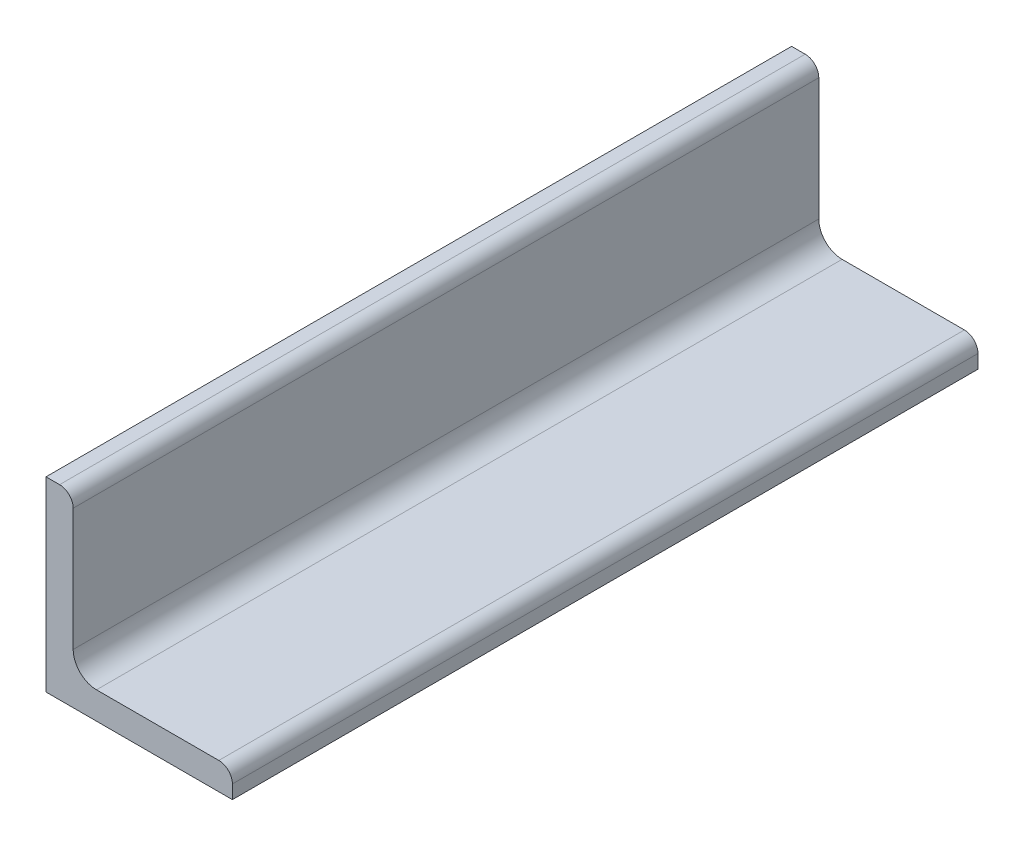
ISO-10303-21;
HEADER;
FILE_DESCRIPTION(('STEP AP214'),'2;1');
FILE_NAME('part.step','',(''),(''),'','','');
FILE_SCHEMA(('AUTOMOTIVE_DESIGN { 1 0 10303 214 1 1 1 1 }'));
ENDSEC;
DATA;
#1=APPLICATION_CONTEXT('core data for automotive mechanical design processes');
#2=APPLICATION_PROTOCOL_DEFINITION('international standard','automotive_design',2000,#1);
#3=PRODUCT_CONTEXT('',#1,'mechanical');
#4=PRODUCT('Part','Part','',(#3));
#5=PRODUCT_RELATED_PRODUCT_CATEGORY('part','',(#4));
#6=PRODUCT_DEFINITION_FORMATION('','',#4);
#7=PRODUCT_DEFINITION_CONTEXT('part definition',#1,'design');
#8=PRODUCT_DEFINITION('design','',#6,#7);
#9=PRODUCT_DEFINITION_SHAPE('','',#8);
#10=(LENGTH_UNIT() NAMED_UNIT(*) SI_UNIT(.MILLI.,.METRE.));
#11=(NAMED_UNIT(*) PLANE_ANGLE_UNIT() SI_UNIT($,.RADIAN.));
#12=(NAMED_UNIT(*) SI_UNIT($,.STERADIAN.) SOLID_ANGLE_UNIT());
#13=UNCERTAINTY_MEASURE_WITH_UNIT(LENGTH_MEASURE(1.E-05),#10,'distance_accuracy_value','');
#14=(GEOMETRIC_REPRESENTATION_CONTEXT(3) GLOBAL_UNCERTAINTY_ASSIGNED_CONTEXT((#13)) GLOBAL_UNIT_ASSIGNED_CONTEXT((#10,
#11,#12)) REPRESENTATION_CONTEXT('',''));
#15=CARTESIAN_POINT('',(0.,0.,0.));
#16=DIRECTION('',(0.,0.,1.));
#17=DIRECTION('',(1.,0.,0.));
#18=AXIS2_PLACEMENT_3D('',#15,#16,#17);
#19=CARTESIAN_POINT('',(0.490776827053332,76.2882459217981,304.8));
#20=DIRECTION('',(1.,0.,0.));
#21=DIRECTION('',(0.,0.,-1.));
#22=AXIS2_PLACEMENT_3D('',#19,#20,#21);
#23=PLANE('',#22);
#24=DIRECTION('',(0.,-1.,0.));
#25=VECTOR('',#24,1.);
#26=CARTESIAN_POINT('',(0.490776827053332,76.2882459217981,0.));
#27=LINE('',#26,#25);
#28=CARTESIAN_POINT('',(0.490776827053332,76.2882459217981,0.));
#29=VERTEX_POINT('',#28);
#30=CARTESIAN_POINT('',(0.490776827053332,0.0882459217980795,0.));
#31=VERTEX_POINT('',#30);
#32=EDGE_CURVE('E135',#29,#31,#27,.T.);
#33=ORIENTED_EDGE('',*,*,#32,.T.);
#34=DIRECTION('',(0.,0.,-1.));
#35=VECTOR('',#34,1.);
#36=CARTESIAN_POINT('',(0.490776827053332,0.0882459217980795,304.8));
#37=LINE('',#36,#35);
#38=CARTESIAN_POINT('',(0.490776827053332,0.0882459217980795,304.8));
#39=VERTEX_POINT('',#38);
#40=EDGE_CURVE('E11',#39,#31,#37,.T.);
#41=ORIENTED_EDGE('',*,*,#40,.F.);
#42=DIRECTION('',(0.,-1.,0.));
#43=VECTOR('',#42,1.);
#44=CARTESIAN_POINT('',(0.490776827053332,76.2882459217981,304.8));
#45=LINE('',#44,#43);
#46=CARTESIAN_POINT('',(0.490776827053332,76.2882459217981,304.8));
#47=VERTEX_POINT('',#46);
#48=EDGE_CURVE('E151',#47,#39,#45,.T.);
#49=ORIENTED_EDGE('',*,*,#48,.F.);
#50=DIRECTION('',(0.,0.,-1.));
#51=VECTOR('',#50,1.);
#52=CARTESIAN_POINT('',(0.490776827053332,76.2882459217981,304.8));
#53=LINE('',#52,#51);
#54=EDGE_CURVE('E131',#47,#29,#53,.T.);
#55=ORIENTED_EDGE('',*,*,#54,.T.);
#56=EDGE_LOOP('',(#33,#41,#49,#55));
#57=FACE_BOUND('',#56,.T.);
#58=ADVANCED_FACE('F33',(#57),#23,.F.);
#59=CARTESIAN_POINT('',(0.490776827053332,0.0882459217980795,304.8));
#60=DIRECTION('',(0.,1.,0.));
#61=DIRECTION('',(0.,0.,1.));
#62=AXIS2_PLACEMENT_3D('',#59,#60,#61);
#63=PLANE('',#62);
#64=DIRECTION('',(1.,0.,0.));
#65=VECTOR('',#64,1.);
#66=CARTESIAN_POINT('',(0.490776827053332,0.0882459217980795,0.));
#67=LINE('',#66,#65);
#68=CARTESIAN_POINT('',(76.6907768270533,0.0882459217980795,0.));
#69=VERTEX_POINT('',#68);
#70=EDGE_CURVE('E138',#31,#69,#67,.T.);
#71=ORIENTED_EDGE('',*,*,#70,.T.);
#72=DIRECTION('',(0.,0.,-1.));
#73=VECTOR('',#72,1.);
#74=CARTESIAN_POINT('',(76.6907768270533,0.0882459217980795,304.8));
#75=LINE('',#74,#73);
#76=CARTESIAN_POINT('',(76.6907768270533,0.0882459217980795,304.8));
#77=VERTEX_POINT('',#76);
#78=EDGE_CURVE('E41',#77,#69,#75,.T.);
#79=ORIENTED_EDGE('',*,*,#78,.F.);
#80=DIRECTION('',(1.,0.,0.));
#81=VECTOR('',#80,1.);
#82=CARTESIAN_POINT('',(0.490776827053332,0.0882459217980795,304.8));
#83=LINE('',#82,#81);
#84=EDGE_CURVE('E95',#39,#77,#83,.T.);
#85=ORIENTED_EDGE('',*,*,#84,.F.);
#86=ORIENTED_EDGE('',*,*,#40,.T.);
#87=EDGE_LOOP('',(#71,#79,#85,#86));
#88=FACE_BOUND('',#87,.T.);
#89=ADVANCED_FACE('F194',(#88),#63,.F.);
#90=CARTESIAN_POINT('',(76.6907768270533,0.0882459217980795,304.8));
#91=DIRECTION('',(-1.,0.,0.));
#92=DIRECTION('',(0.,0.,1.));
#93=AXIS2_PLACEMENT_3D('',#90,#91,#92);
#94=PLANE('',#93);
#95=DIRECTION('',(0.,1.,0.));
#96=VECTOR('',#95,1.);
#97=CARTESIAN_POINT('',(76.6907768270533,0.0882459217980795,0.));
#98=LINE('',#97,#96);
#99=CARTESIAN_POINT('',(76.6907768270533,5.64449592179808,0.));
#100=VERTEX_POINT('',#99);
#101=EDGE_CURVE('E140',#69,#100,#98,.T.);
#102=ORIENTED_EDGE('',*,*,#101,.T.);
#103=DIRECTION('',(0.,0.,-1.));
#104=VECTOR('',#103,1.);
#105=CARTESIAN_POINT('',(76.6907768270533,5.64449592179808,304.8));
#106=LINE('',#105,#104);
#107=CARTESIAN_POINT('',(76.6907768270533,5.64449592179808,304.8));
#108=VERTEX_POINT('',#107);
#109=EDGE_CURVE('E161',#108,#100,#106,.T.);
#110=ORIENTED_EDGE('',*,*,#109,.F.);
#111=DIRECTION('',(0.,1.,0.));
#112=VECTOR('',#111,1.);
#113=CARTESIAN_POINT('',(76.6907768270533,0.0882459217980795,304.8));
#114=LINE('',#113,#112);
#115=EDGE_CURVE('E169',#77,#108,#114,.T.);
#116=ORIENTED_EDGE('',*,*,#115,.F.);
#117=ORIENTED_EDGE('',*,*,#78,.T.);
#118=EDGE_LOOP('',(#102,#110,#116,#117));
#119=FACE_BOUND('',#118,.T.);
#120=ADVANCED_FACE('F167',(#119),#94,.F.);
#121=CARTESIAN_POINT('',(71.1345268270533,5.64449592179808,304.8));
#122=DIRECTION('',(0.,0.,-1.));
#123=DIRECTION('',(-1.,0.,0.));
#124=AXIS2_PLACEMENT_3D('',#121,#122,#123);
#125=CYLINDRICAL_SURFACE('',#124,5.55625);
#126=CARTESIAN_POINT('',(71.1345268270533,5.64449592179808,0.));
#127=DIRECTION('',(0.,0.,1.));
#128=DIRECTION('',(1.,0.,0.));
#129=AXIS2_PLACEMENT_3D('',#126,#127,#128);
#130=CIRCLE('',#129,5.55625);
#131=CARTESIAN_POINT('',(71.1345268270533,11.2007459217981,0.));
#132=VERTEX_POINT('',#131);
#133=EDGE_CURVE('E142',#100,#132,#130,.T.);
#134=ORIENTED_EDGE('',*,*,#133,.T.);
#135=DIRECTION('',(0.,0.,-1.));
#136=VECTOR('',#135,1.);
#137=CARTESIAN_POINT('',(71.1345268270533,11.2007459217981,304.8));
#138=LINE('',#137,#136);
#139=CARTESIAN_POINT('',(71.1345268270533,11.2007459217981,304.8));
#140=VERTEX_POINT('',#139);
#141=EDGE_CURVE('E158',#140,#132,#138,.T.);
#142=ORIENTED_EDGE('',*,*,#141,.F.);
#143=CARTESIAN_POINT('',(71.1345268270533,5.64449592179808,304.8));
#144=DIRECTION('',(0.,0.,1.));
#145=DIRECTION('',(1.,0.,0.));
#146=AXIS2_PLACEMENT_3D('',#143,#144,#145);
#147=CIRCLE('',#146,5.55625);
#148=EDGE_CURVE('E185',#108,#140,#147,.T.);
#149=ORIENTED_EDGE('',*,*,#148,.F.);
#150=ORIENTED_EDGE('',*,*,#109,.T.);
#151=EDGE_LOOP('',(#134,#142,#149,#150));
#152=FACE_BOUND('',#151,.T.);
#153=ADVANCED_FACE('F178',(#152),#125,.T.);
#154=CARTESIAN_POINT('',(71.1345268270533,11.2007459217981,304.8));
#155=DIRECTION('',(0.,-1.,0.));
#156=DIRECTION('',(0.,0.,-1.));
#157=AXIS2_PLACEMENT_3D('',#154,#155,#156);
#158=PLANE('',#157);
#159=DIRECTION('',(-1.,0.,0.));
#160=VECTOR('',#159,1.);
#161=CARTESIAN_POINT('',(71.1345268270533,11.2007459217981,0.));
#162=LINE('',#161,#160);
#163=CARTESIAN_POINT('',(21.1282768270533,11.2007459217981,0.));
#164=VERTEX_POINT('',#163);
#165=EDGE_CURVE('E144',#132,#164,#162,.T.);
#166=ORIENTED_EDGE('',*,*,#165,.T.);
#167=DIRECTION('',(0.,0.,-1.));
#168=VECTOR('',#167,1.);
#169=CARTESIAN_POINT('',(21.1282768270533,11.2007459217981,304.8));
#170=LINE('',#169,#168);
#171=CARTESIAN_POINT('',(21.1282768270533,11.2007459217981,304.8));
#172=VERTEX_POINT('',#171);
#173=EDGE_CURVE('E155',#172,#164,#170,.T.);
#174=ORIENTED_EDGE('',*,*,#173,.F.);
#175=DIRECTION('',(-1.,0.,0.));
#176=VECTOR('',#175,1.);
#177=CARTESIAN_POINT('',(71.1345268270533,11.2007459217981,304.8));
#178=LINE('',#177,#176);
#179=EDGE_CURVE('E184',#140,#172,#178,.T.);
#180=ORIENTED_EDGE('',*,*,#179,.F.);
#181=ORIENTED_EDGE('',*,*,#141,.T.);
#182=EDGE_LOOP('',(#166,#174,#180,#181));
#183=FACE_BOUND('',#182,.T.);
#184=ADVANCED_FACE('F182',(#183),#158,.F.);
#185=CARTESIAN_POINT('',(21.1282768270533,20.7257459217981,304.8));
#186=DIRECTION('',(0.,0.,-1.));
#187=DIRECTION('',(-1.,0.,0.));
#188=AXIS2_PLACEMENT_3D('',#185,#186,#187);
#189=CYLINDRICAL_SURFACE('',#188,9.52499999999999);
#190=CARTESIAN_POINT('',(21.1282768270533,20.7257459217981,0.));
#191=DIRECTION('',(0.,0.,-1.));
#192=DIRECTION('',(1.,0.,0.));
#193=AXIS2_PLACEMENT_3D('',#190,#191,#192);
#194=CIRCLE('',#193,9.52499999999999);
#195=CARTESIAN_POINT('',(11.6032768270533,20.7257459217981,0.));
#196=VERTEX_POINT('',#195);
#197=EDGE_CURVE('E146',#164,#196,#194,.T.);
#198=ORIENTED_EDGE('',*,*,#197,.T.);
#199=DIRECTION('',(0.,0.,-1.));
#200=VECTOR('',#199,1.);
#201=CARTESIAN_POINT('',(11.6032768270533,20.7257459217981,304.8));
#202=LINE('',#201,#200);
#203=CARTESIAN_POINT('',(11.6032768270533,20.7257459217981,304.8));
#204=VERTEX_POINT('',#203);
#205=EDGE_CURVE('E126',#204,#196,#202,.T.);
#206=ORIENTED_EDGE('',*,*,#205,.F.);
#207=CARTESIAN_POINT('',(21.1282768270533,20.7257459217981,304.8));
#208=DIRECTION('',(0.,0.,-1.));
#209=DIRECTION('',(1.,0.,0.));
#210=AXIS2_PLACEMENT_3D('',#207,#208,#209);
#211=CIRCLE('',#210,9.52499999999999);
#212=EDGE_CURVE('E117',#172,#204,#211,.T.);
#213=ORIENTED_EDGE('',*,*,#212,.F.);
#214=ORIENTED_EDGE('',*,*,#173,.T.);
#215=EDGE_LOOP('',(#198,#206,#213,#214));
#216=FACE_BOUND('',#215,.T.);
#217=ADVANCED_FACE('F206',(#216),#189,.F.);
#218=CARTESIAN_POINT('',(11.6032768270533,20.7257459217981,304.8));
#219=DIRECTION('',(-1.,0.,0.));
#220=DIRECTION('',(0.,0.,1.));
#221=AXIS2_PLACEMENT_3D('',#218,#219,#220);
#222=PLANE('',#221);
#223=DIRECTION('',(0.,1.,0.));
#224=VECTOR('',#223,1.);
#225=CARTESIAN_POINT('',(11.6032768270533,20.7257459217981,0.));
#226=LINE('',#225,#224);
#227=CARTESIAN_POINT('',(11.6032768270533,70.7319959217981,0.));
#228=VERTEX_POINT('',#227);
#229=EDGE_CURVE('E125',#196,#228,#226,.T.);
#230=ORIENTED_EDGE('',*,*,#229,.T.);
#231=DIRECTION('',(0.,0.,-1.));
#232=VECTOR('',#231,1.);
#233=CARTESIAN_POINT('',(11.6032768270533,70.7319959217981,304.8));
#234=LINE('',#233,#232);
#235=CARTESIAN_POINT('',(11.6032768270533,70.7319959217981,304.8));
#236=VERTEX_POINT('',#235);
#237=EDGE_CURVE('E122',#236,#228,#234,.T.);
#238=ORIENTED_EDGE('',*,*,#237,.F.);
#239=DIRECTION('',(0.,1.,0.));
#240=VECTOR('',#239,1.);
#241=CARTESIAN_POINT('',(11.6032768270533,20.7257459217981,304.8));
#242=LINE('',#241,#240);
#243=EDGE_CURVE('E111',#204,#236,#242,.T.);
#244=ORIENTED_EDGE('',*,*,#243,.F.);
#245=ORIENTED_EDGE('',*,*,#205,.T.);
#246=EDGE_LOOP('',(#230,#238,#244,#245));
#247=FACE_BOUND('',#246,.T.);
#248=ADVANCED_FACE('F123',(#247),#222,.F.);
#249=CARTESIAN_POINT('',(6.04702682705333,70.7319959217981,304.8));
#250=DIRECTION('',(0.,0.,-1.));
#251=DIRECTION('',(-1.,0.,0.));
#252=AXIS2_PLACEMENT_3D('',#249,#250,#251);
#253=CYLINDRICAL_SURFACE('',#252,5.55625);
#254=CARTESIAN_POINT('',(6.04702682705333,70.7319959217981,0.));
#255=DIRECTION('',(0.,0.,1.));
#256=DIRECTION('',(1.,0.,0.));
#257=AXIS2_PLACEMENT_3D('',#254,#255,#256);
#258=CIRCLE('',#257,5.55625);
#259=CARTESIAN_POINT('',(6.04702682705333,76.2882459217981,0.));
#260=VERTEX_POINT('',#259);
#261=EDGE_CURVE('E81',#228,#260,#258,.T.);
#262=ORIENTED_EDGE('',*,*,#261,.T.);
#263=DIRECTION('',(0.,0.,-1.));
#264=VECTOR('',#263,1.);
#265=CARTESIAN_POINT('',(6.04702682705333,76.2882459217981,304.8));
#266=LINE('',#265,#264);
#267=CARTESIAN_POINT('',(6.04702682705333,76.2882459217981,304.8));
#268=VERTEX_POINT('',#267);
#269=EDGE_CURVE('E127',#268,#260,#266,.T.);
#270=ORIENTED_EDGE('',*,*,#269,.F.);
#271=CARTESIAN_POINT('',(6.04702682705333,70.7319959217981,304.8));
#272=DIRECTION('',(0.,0.,1.));
#273=DIRECTION('',(1.,0.,0.));
#274=AXIS2_PLACEMENT_3D('',#271,#272,#273);
#275=CIRCLE('',#274,5.55625);
#276=EDGE_CURVE('E115',#236,#268,#275,.T.);
#277=ORIENTED_EDGE('',*,*,#276,.F.);
#278=ORIENTED_EDGE('',*,*,#237,.T.);
#279=EDGE_LOOP('',(#262,#270,#277,#278));
#280=FACE_BOUND('',#279,.T.);
#281=ADVANCED_FACE('F129',(#280),#253,.T.);
#282=CARTESIAN_POINT('',(6.04702682705333,76.2882459217981,304.8));
#283=DIRECTION('',(0.,-1.,0.));
#284=DIRECTION('',(0.,0.,-1.));
#285=AXIS2_PLACEMENT_3D('',#282,#283,#284);
#286=PLANE('',#285);
#287=DIRECTION('',(-1.,0.,0.));
#288=VECTOR('',#287,1.);
#289=CARTESIAN_POINT('',(6.04702682705333,76.2882459217981,0.));
#290=LINE('',#289,#288);
#291=EDGE_CURVE('E87',#260,#29,#290,.T.);
#292=ORIENTED_EDGE('',*,*,#291,.T.);
#293=ORIENTED_EDGE('',*,*,#54,.F.);
#294=DIRECTION('',(-1.,0.,0.));
#295=VECTOR('',#294,1.);
#296=CARTESIAN_POINT('',(6.04702682705333,76.2882459217981,304.8));
#297=LINE('',#296,#295);
#298=EDGE_CURVE('E49',#268,#47,#297,.T.);
#299=ORIENTED_EDGE('',*,*,#298,.F.);
#300=ORIENTED_EDGE('',*,*,#269,.T.);
#301=EDGE_LOOP('',(#292,#293,#299,#300));
#302=FACE_BOUND('',#301,.T.);
#303=ADVANCED_FACE('F214',(#302),#286,.F.);
#304=CARTESIAN_POINT('',(71.1345268270533,5.64449592179808,304.8));
#305=DIRECTION('',(0.,0.,1.));
#306=DIRECTION('',(1.,0.,0.));
#307=AXIS2_PLACEMENT_3D('',#304,#305,#306);
#308=PLANE('',#307);
#309=ORIENTED_EDGE('',*,*,#48,.T.);
#310=ORIENTED_EDGE('',*,*,#84,.T.);
#311=ORIENTED_EDGE('',*,*,#115,.T.);
#312=ORIENTED_EDGE('',*,*,#148,.T.);
#313=ORIENTED_EDGE('',*,*,#179,.T.);
#314=ORIENTED_EDGE('',*,*,#212,.T.);
#315=ORIENTED_EDGE('',*,*,#243,.T.);
#316=ORIENTED_EDGE('',*,*,#276,.T.);
#317=ORIENTED_EDGE('',*,*,#298,.T.);
#318=EDGE_LOOP('',(#309,#310,#311,#312,#313,#314,#315,#316,#317));
#319=FACE_BOUND('',#318,.T.);
#320=ADVANCED_FACE('F113',(#319),#308,.T.);
#321=CARTESIAN_POINT('',(71.1345268270533,5.64449592179808,0.));
#322=DIRECTION('',(0.,0.,1.));
#323=DIRECTION('',(1.,0.,0.));
#324=AXIS2_PLACEMENT_3D('',#321,#322,#323);
#325=PLANE('',#324);
#326=ORIENTED_EDGE('',*,*,#32,.F.);
#327=ORIENTED_EDGE('',*,*,#291,.F.);
#328=ORIENTED_EDGE('',*,*,#261,.F.);
#329=ORIENTED_EDGE('',*,*,#229,.F.);
#330=ORIENTED_EDGE('',*,*,#197,.F.);
#331=ORIENTED_EDGE('',*,*,#165,.F.);
#332=ORIENTED_EDGE('',*,*,#133,.F.);
#333=ORIENTED_EDGE('',*,*,#101,.F.);
#334=ORIENTED_EDGE('',*,*,#70,.F.);
#335=EDGE_LOOP('',(#326,#327,#328,#329,#330,#331,#332,#333,#334));
#336=FACE_BOUND('',#335,.T.);
#337=ADVANCED_FACE('F173',(#336),#325,.F.);
#338=CLOSED_SHELL('',(#58,#89,#120,#153,#184,#217,#248,#281,#303,#320,#337));
#339=MANIFOLD_SOLID_BREP('B2',#338);
#340=ADVANCED_BREP_SHAPE_REPRESENTATION('',(#18,#339),#14);
#341=SHAPE_DEFINITION_REPRESENTATION(#9,#340);
ENDSEC;
END-ISO-10303-21;
